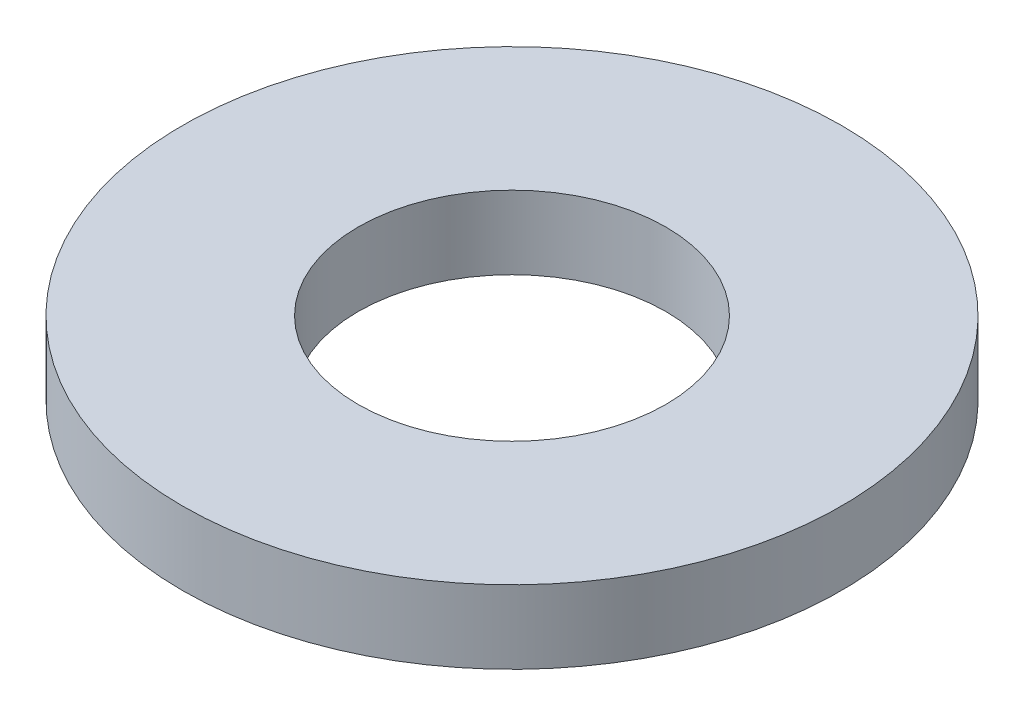
ISO-10303-21;
HEADER;
FILE_DESCRIPTION(('STEP AP214'),'2;1');
FILE_NAME('part.step','',(''),(''),'','','');
FILE_SCHEMA(('AUTOMOTIVE_DESIGN { 1 0 10303 214 1 1 1 1 }'));
ENDSEC;
DATA;
#1=APPLICATION_CONTEXT('core data for automotive mechanical design processes');
#2=APPLICATION_PROTOCOL_DEFINITION('international standard','automotive_design',2000,#1);
#3=PRODUCT_CONTEXT('',#1,'mechanical');
#4=PRODUCT('Part','Part','',(#3));
#5=PRODUCT_RELATED_PRODUCT_CATEGORY('part','',(#4));
#6=PRODUCT_DEFINITION_FORMATION('','',#4);
#7=PRODUCT_DEFINITION_CONTEXT('part definition',#1,'design');
#8=PRODUCT_DEFINITION('design','',#6,#7);
#9=PRODUCT_DEFINITION_SHAPE('','',#8);
#10=(LENGTH_UNIT() NAMED_UNIT(*) SI_UNIT(.MILLI.,.METRE.));
#11=(NAMED_UNIT(*) PLANE_ANGLE_UNIT() SI_UNIT($,.RADIAN.));
#12=(NAMED_UNIT(*) SI_UNIT($,.STERADIAN.) SOLID_ANGLE_UNIT());
#13=UNCERTAINTY_MEASURE_WITH_UNIT(LENGTH_MEASURE(1.E-05),#10,'distance_accuracy_value','');
#14=(GEOMETRIC_REPRESENTATION_CONTEXT(3) GLOBAL_UNCERTAINTY_ASSIGNED_CONTEXT((#13)) GLOBAL_UNIT_ASSIGNED_CONTEXT((#10,
#11,#12)) REPRESENTATION_CONTEXT('',''));
#15=CARTESIAN_POINT('',(0.,0.,0.));
#16=DIRECTION('',(0.,0.,1.));
#17=DIRECTION('',(1.,0.,0.));
#18=AXIS2_PLACEMENT_3D('',#15,#16,#17);
#19=CARTESIAN_POINT('',(0.,0.,0.));
#20=DIRECTION('',(0.,-1.,0.));
#21=DIRECTION('',(0.,0.,-1.));
#22=AXIS2_PLACEMENT_3D('',#19,#20,#21);
#23=CYLINDRICAL_SURFACE('',#22,4.5);
#24=CARTESIAN_POINT('',(0.,0.999999999999999,0.));
#25=DIRECTION('',(0.,-1.,0.));
#26=DIRECTION('',(0.,0.,-1.));
#27=AXIS2_PLACEMENT_3D('',#24,#25,#26);
#28=CIRCLE('',#27,4.5);
#29=CARTESIAN_POINT('',(0.,0.999999999999999,-4.5));
#30=VERTEX_POINT('',#29);
#31=EDGE_CURVE('E46',#30,#30,#28,.T.);
#32=ORIENTED_EDGE('',*,*,#31,.T.);
#33=EDGE_LOOP('',(#32));
#34=FACE_BOUND('',#33,.T.);
#35=CARTESIAN_POINT('',(0.,0.,0.));
#36=DIRECTION('',(0.,-1.,0.));
#37=DIRECTION('',(0.,0.,-1.));
#38=AXIS2_PLACEMENT_3D('',#35,#36,#37);
#39=CIRCLE('',#38,4.5);
#40=CARTESIAN_POINT('',(0.,0.,-4.5));
#41=VERTEX_POINT('',#40);
#42=EDGE_CURVE('E10',#41,#41,#39,.T.);
#43=ORIENTED_EDGE('',*,*,#42,.F.);
#44=EDGE_LOOP('',(#43));
#45=FACE_BOUND('',#44,.T.);
#46=ADVANCED_FACE('F32',(#34,#45),#23,.T.);
#47=CARTESIAN_POINT('',(4.5,0.,0.));
#48=DIRECTION('',(0.,-1.,0.));
#49=DIRECTION('',(0.,0.,-1.));
#50=AXIS2_PLACEMENT_3D('',#47,#48,#49);
#51=PLANE('',#50);
#52=ORIENTED_EDGE('',*,*,#42,.T.);
#53=EDGE_LOOP('',(#52));
#54=FACE_BOUND('',#53,.T.);
#55=CARTESIAN_POINT('',(0.,0.,0.));
#56=DIRECTION('',(0.,-1.,0.));
#57=DIRECTION('',(0.,0.,-1.));
#58=AXIS2_PLACEMENT_3D('',#55,#56,#57);
#59=CIRCLE('',#58,2.1);
#60=CARTESIAN_POINT('',(0.,0.,-2.1));
#61=VERTEX_POINT('',#60);
#62=EDGE_CURVE('E38',#61,#61,#59,.T.);
#63=ORIENTED_EDGE('',*,*,#62,.F.);
#64=EDGE_LOOP('',(#63));
#65=FACE_BOUND('',#64,.T.);
#66=ADVANCED_FACE('F62',(#54,#65),#51,.T.);
#67=CARTESIAN_POINT('',(0.,0.,0.));
#68=DIRECTION('',(0.,-1.,0.));
#69=DIRECTION('',(0.,0.,-1.));
#70=AXIS2_PLACEMENT_3D('',#67,#68,#69);
#71=CYLINDRICAL_SURFACE('',#70,2.1);
#72=ORIENTED_EDGE('',*,*,#62,.T.);
#73=EDGE_LOOP('',(#72));
#74=FACE_BOUND('',#73,.T.);
#75=CARTESIAN_POINT('',(0.,1.,0.));
#76=DIRECTION('',(0.,-1.,0.));
#77=DIRECTION('',(0.,0.,-1.));
#78=AXIS2_PLACEMENT_3D('',#75,#76,#77);
#79=CIRCLE('',#78,2.1);
#80=CARTESIAN_POINT('',(0.,1.,-2.1));
#81=VERTEX_POINT('',#80);
#82=EDGE_CURVE('E42',#81,#81,#79,.T.);
#83=ORIENTED_EDGE('',*,*,#82,.F.);
#84=EDGE_LOOP('',(#83));
#85=FACE_BOUND('',#84,.T.);
#86=ADVANCED_FACE('F56',(#74,#85),#71,.F.);
#87=CARTESIAN_POINT('',(2.1,1.,0.));
#88=DIRECTION('',(0.,1.,0.));
#89=DIRECTION('',(0.,0.,1.));
#90=AXIS2_PLACEMENT_3D('',#87,#88,#89);
#91=PLANE('',#90);
#92=ORIENTED_EDGE('',*,*,#82,.T.);
#93=EDGE_LOOP('',(#92));
#94=FACE_BOUND('',#93,.T.);
#95=ORIENTED_EDGE('',*,*,#31,.F.);
#96=EDGE_LOOP('',(#95));
#97=FACE_BOUND('',#96,.T.);
#98=ADVANCED_FACE('F54',(#94,#97),#91,.T.);
#99=CLOSED_SHELL('',(#46,#66,#86,#98));
#100=MANIFOLD_SOLID_BREP('B2',#99);
#101=ADVANCED_BREP_SHAPE_REPRESENTATION('',(#18,#100),#14);
#102=SHAPE_DEFINITION_REPRESENTATION(#9,#101);
ENDSEC;
END-ISO-10303-21;
